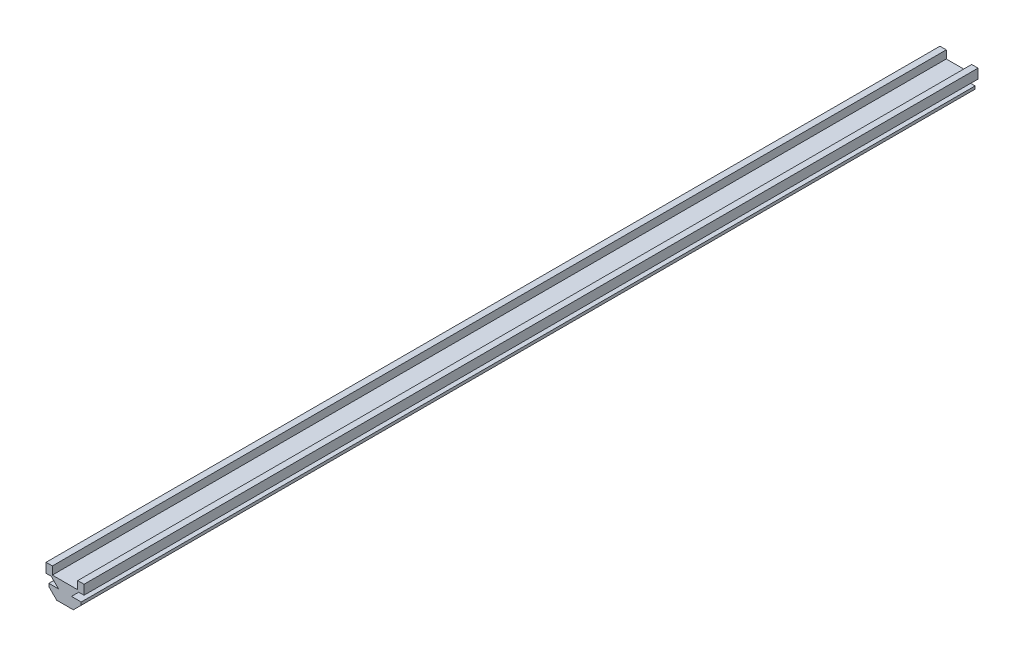
ISO-10303-21;
HEADER;
FILE_DESCRIPTION(('STEP AP214'),'2;1');
FILE_NAME('part.step','',(''),(''),'','','');
FILE_SCHEMA(('AUTOMOTIVE_DESIGN { 1 0 10303 214 1 1 1 1 }'));
ENDSEC;
DATA;
#1=APPLICATION_CONTEXT('core data for automotive mechanical design processes');
#2=APPLICATION_PROTOCOL_DEFINITION('international standard','automotive_design',2000,#1);
#3=PRODUCT_CONTEXT('',#1,'mechanical');
#4=PRODUCT('Part','Part','',(#3));
#5=PRODUCT_RELATED_PRODUCT_CATEGORY('part','',(#4));
#6=PRODUCT_DEFINITION_FORMATION('','',#4);
#7=PRODUCT_DEFINITION_CONTEXT('part definition',#1,'design');
#8=PRODUCT_DEFINITION('design','',#6,#7);
#9=PRODUCT_DEFINITION_SHAPE('','',#8);
#10=(LENGTH_UNIT() NAMED_UNIT(*) SI_UNIT(.MILLI.,.METRE.));
#11=(NAMED_UNIT(*) PLANE_ANGLE_UNIT() SI_UNIT($,.RADIAN.));
#12=(NAMED_UNIT(*) SI_UNIT($,.STERADIAN.) SOLID_ANGLE_UNIT());
#13=UNCERTAINTY_MEASURE_WITH_UNIT(LENGTH_MEASURE(1.E-05),#10,'distance_accuracy_value','');
#14=(GEOMETRIC_REPRESENTATION_CONTEXT(3) GLOBAL_UNCERTAINTY_ASSIGNED_CONTEXT((#13)) GLOBAL_UNIT_ASSIGNED_CONTEXT((#10,
#11,#12)) REPRESENTATION_CONTEXT('',''));
#15=CARTESIAN_POINT('',(0.,0.,0.));
#16=DIRECTION('',(0.,0.,1.));
#17=DIRECTION('',(1.,0.,0.));
#18=AXIS2_PLACEMENT_3D('',#15,#16,#17);
#19=CARTESIAN_POINT('',(4.00000000000002,0.,282.));
#20=DIRECTION('',(-1.,0.,0.));
#21=DIRECTION('',(0.,0.,1.));
#22=AXIS2_PLACEMENT_3D('',#19,#20,#21);
#23=PLANE('',#22);
#24=DIRECTION('',(0.,1.,0.));
#25=VECTOR('',#24,1.);
#26=CARTESIAN_POINT('',(4.00000000000002,0.,0.));
#27=LINE('',#26,#25);
#28=CARTESIAN_POINT('',(4.00000000000002,0.,0.));
#29=VERTEX_POINT('',#28);
#30=CARTESIAN_POINT('',(4.00000000000002,3.00000000000007,0.));
#31=VERTEX_POINT('',#30);
#32=EDGE_CURVE('E201',#29,#31,#27,.T.);
#33=ORIENTED_EDGE('',*,*,#32,.F.);
#34=DIRECTION('',(0.,0.,-1.));
#35=VECTOR('',#34,1.);
#36=CARTESIAN_POINT('',(4.00000000000002,0.,282.));
#37=LINE('',#36,#35);
#38=CARTESIAN_POINT('',(4.00000000000002,0.,282.));
#39=VERTEX_POINT('',#38);
#40=EDGE_CURVE('E11',#39,#29,#37,.T.);
#41=ORIENTED_EDGE('',*,*,#40,.F.);
#42=DIRECTION('',(0.,1.,0.));
#43=VECTOR('',#42,1.);
#44=CARTESIAN_POINT('',(4.00000000000002,0.,282.));
#45=LINE('',#44,#43);
#46=CARTESIAN_POINT('',(4.00000000000002,3.00000000000007,282.));
#47=VERTEX_POINT('',#46);
#48=EDGE_CURVE('E264',#39,#47,#45,.T.);
#49=ORIENTED_EDGE('',*,*,#48,.T.);
#50=DIRECTION('',(0.,0.,-1.));
#51=VECTOR('',#50,1.);
#52=CARTESIAN_POINT('',(4.00000000000002,3.00000000000007,282.));
#53=LINE('',#52,#51);
#54=EDGE_CURVE('E122',#47,#31,#53,.T.);
#55=ORIENTED_EDGE('',*,*,#54,.T.);
#56=EDGE_LOOP('',(#33,#41,#49,#55));
#57=FACE_BOUND('',#56,.T.);
#58=ADVANCED_FACE('F41',(#57),#23,.T.);
#59=CARTESIAN_POINT('',(0.,0.,282.));
#60=DIRECTION('',(0.,-1.,0.));
#61=DIRECTION('',(1.,0.,0.));
#62=AXIS2_PLACEMENT_3D('',#59,#60,#61);
#63=PLANE('',#62);
#64=DIRECTION('',(-1.,0.,0.));
#65=VECTOR('',#64,1.);
#66=CARTESIAN_POINT('',(0.,0.,0.));
#67=LINE('',#66,#65);
#68=CARTESIAN_POINT('',(5.65710678118656,0.,0.));
#69=VERTEX_POINT('',#68);
#70=EDGE_CURVE('E205',#69,#29,#67,.T.);
#71=ORIENTED_EDGE('',*,*,#70,.F.);
#72=DIRECTION('',(0.,0.,-1.));
#73=VECTOR('',#72,1.);
#74=CARTESIAN_POINT('',(5.65710678118656,0.,282.));
#75=LINE('',#74,#73);
#76=CARTESIAN_POINT('',(5.65710678118656,0.,282.));
#77=VERTEX_POINT('',#76);
#78=EDGE_CURVE('E50',#77,#69,#75,.T.);
#79=ORIENTED_EDGE('',*,*,#78,.F.);
#80=DIRECTION('',(-1.,0.,0.));
#81=VECTOR('',#80,1.);
#82=CARTESIAN_POINT('',(0.,0.,282.));
#83=LINE('',#82,#81);
#84=EDGE_CURVE('E332',#77,#39,#83,.T.);
#85=ORIENTED_EDGE('',*,*,#84,.T.);
#86=ORIENTED_EDGE('',*,*,#40,.T.);
#87=EDGE_LOOP('',(#71,#79,#85,#86));
#88=FACE_BOUND('',#87,.T.);
#89=ADVANCED_FACE('F321',(#88),#63,.T.);
#90=CARTESIAN_POINT('',(2.82855339059332,2.82855339059331,282.));
#91=DIRECTION('',(-0.707106781186548,-0.707106781186547,0.));
#92=DIRECTION('',(0.707106781186547,-0.707106781186548,0.));
#93=AXIS2_PLACEMENT_3D('',#90,#91,#92);
#94=PLANE('',#93);
#95=DIRECTION('',(-0.707106781186547,0.707106781186548,0.));
#96=VECTOR('',#95,1.);
#97=CARTESIAN_POINT('',(2.82855339059332,2.82855339059331,0.));
#98=LINE('',#97,#96);
#99=CARTESIAN_POINT('',(7.95710678118658,-2.29999999999996,0.));
#100=VERTEX_POINT('',#99);
#101=EDGE_CURVE('E209',#100,#69,#98,.T.);
#102=ORIENTED_EDGE('',*,*,#101,.F.);
#103=DIRECTION('',(0.,0.,-1.));
#104=VECTOR('',#103,1.);
#105=CARTESIAN_POINT('',(7.95710678118658,-2.29999999999996,282.));
#106=LINE('',#105,#104);
#107=CARTESIAN_POINT('',(7.95710678118658,-2.29999999999996,282.));
#108=VERTEX_POINT('',#107);
#109=EDGE_CURVE('E308',#108,#100,#106,.T.);
#110=ORIENTED_EDGE('',*,*,#109,.F.);
#111=DIRECTION('',(-0.707106781186547,0.707106781186548,0.));
#112=VECTOR('',#111,1.);
#113=CARTESIAN_POINT('',(2.82855339059332,2.82855339059331,282.));
#114=LINE('',#113,#112);
#115=EDGE_CURVE('E317',#108,#77,#114,.T.);
#116=ORIENTED_EDGE('',*,*,#115,.T.);
#117=ORIENTED_EDGE('',*,*,#78,.T.);
#118=EDGE_LOOP('',(#102,#110,#116,#117));
#119=FACE_BOUND('',#118,.T.);
#120=ADVANCED_FACE('F315',(#119),#94,.T.);
#121=CARTESIAN_POINT('',(0.,-2.29999999999996,282.));
#122=DIRECTION('',(0.,1.,0.));
#123=DIRECTION('',(0.,0.,1.));
#124=AXIS2_PLACEMENT_3D('',#121,#122,#123);
#125=PLANE('',#124);
#126=DIRECTION('',(1.,0.,0.));
#127=VECTOR('',#126,1.);
#128=CARTESIAN_POINT('',(0.,-2.29999999999996,0.));
#129=LINE('',#128,#127);
#130=CARTESIAN_POINT('',(4.90000000000005,-2.29999999999996,0.));
#131=VERTEX_POINT('',#130);
#132=EDGE_CURVE('E213',#131,#100,#129,.T.);
#133=ORIENTED_EDGE('',*,*,#132,.F.);
#134=DIRECTION('',(0.,0.,-1.));
#135=VECTOR('',#134,1.);
#136=CARTESIAN_POINT('',(4.90000000000005,-2.29999999999996,282.));
#137=LINE('',#136,#135);
#138=CARTESIAN_POINT('',(4.90000000000005,-2.29999999999996,282.));
#139=VERTEX_POINT('',#138);
#140=EDGE_CURVE('E305',#139,#131,#137,.T.);
#141=ORIENTED_EDGE('',*,*,#140,.F.);
#142=DIRECTION('',(1.,0.,0.));
#143=VECTOR('',#142,1.);
#144=CARTESIAN_POINT('',(0.,-2.29999999999996,282.));
#145=LINE('',#144,#143);
#146=EDGE_CURVE('E331',#139,#108,#145,.T.);
#147=ORIENTED_EDGE('',*,*,#146,.T.);
#148=ORIENTED_EDGE('',*,*,#109,.T.);
#149=EDGE_LOOP('',(#133,#141,#147,#148));
#150=FACE_BOUND('',#149,.T.);
#151=ADVANCED_FACE('F327',(#150),#125,.T.);
#152=CARTESIAN_POINT('',(4.90000000000005,0.,282.));
#153=DIRECTION('',(1.,0.,0.));
#154=DIRECTION('',(0.,0.,-1.));
#155=AXIS2_PLACEMENT_3D('',#152,#153,#154);
#156=PLANE('',#155);
#157=DIRECTION('',(0.,-1.,0.));
#158=VECTOR('',#157,1.);
#159=CARTESIAN_POINT('',(4.90000000000005,0.,0.));
#160=LINE('',#159,#158);
#161=CARTESIAN_POINT('',(4.90000000000005,-3.20294372515229,0.));
#162=VERTEX_POINT('',#161);
#163=EDGE_CURVE('E217',#131,#162,#160,.T.);
#164=ORIENTED_EDGE('',*,*,#163,.T.);
#165=DIRECTION('',(0.,0.,-1.));
#166=VECTOR('',#165,1.);
#167=CARTESIAN_POINT('',(4.90000000000005,-3.20294372515229,282.));
#168=LINE('',#167,#166);
#169=CARTESIAN_POINT('',(4.90000000000005,-3.20294372515229,282.));
#170=VERTEX_POINT('',#169);
#171=EDGE_CURVE('E302',#170,#162,#168,.T.);
#172=ORIENTED_EDGE('',*,*,#171,.F.);
#173=DIRECTION('',(0.,-1.,0.));
#174=VECTOR('',#173,1.);
#175=CARTESIAN_POINT('',(4.90000000000005,0.,282.));
#176=LINE('',#175,#174);
#177=EDGE_CURVE('E337',#139,#170,#176,.T.);
#178=ORIENTED_EDGE('',*,*,#177,.F.);
#179=ORIENTED_EDGE('',*,*,#140,.T.);
#180=EDGE_LOOP('',(#164,#172,#178,#179));
#181=FACE_BOUND('',#180,.T.);
#182=ADVANCED_FACE('F394',(#181),#156,.F.);
#183=CARTESIAN_POINT('',(0.848528137423882,0.848528137423882,282.));
#184=DIRECTION('',(-0.707106781186548,-0.707106781186548,0.));
#185=DIRECTION('',(0.707106781186548,-0.707106781186548,0.));
#186=AXIS2_PLACEMENT_3D('',#183,#184,#185);
#187=PLANE('',#186);
#188=DIRECTION('',(-0.707106781186548,0.707106781186548,0.));
#189=VECTOR('',#188,1.);
#190=CARTESIAN_POINT('',(0.848528137423882,0.848528137423882,0.));
#191=LINE('',#190,#189);
#192=CARTESIAN_POINT('',(7.37205627484774,-5.67499999999998,0.));
#193=VERTEX_POINT('',#192);
#194=EDGE_CURVE('E221',#193,#162,#191,.T.);
#195=ORIENTED_EDGE('',*,*,#194,.F.);
#196=DIRECTION('',(0.,0.,-1.));
#197=VECTOR('',#196,1.);
#198=CARTESIAN_POINT('',(7.37205627484774,-5.67499999999998,282.));
#199=LINE('',#198,#197);
#200=CARTESIAN_POINT('',(7.37205627484774,-5.67499999999998,282.));
#201=VERTEX_POINT('',#200);
#202=EDGE_CURVE('E299',#201,#193,#199,.T.);
#203=ORIENTED_EDGE('',*,*,#202,.F.);
#204=DIRECTION('',(-0.707106781186548,0.707106781186548,0.));
#205=VECTOR('',#204,1.);
#206=CARTESIAN_POINT('',(0.848528137423882,0.848528137423882,282.));
#207=LINE('',#206,#205);
#208=EDGE_CURVE('E344',#201,#170,#207,.T.);
#209=ORIENTED_EDGE('',*,*,#208,.T.);
#210=ORIENTED_EDGE('',*,*,#171,.T.);
#211=EDGE_LOOP('',(#195,#203,#209,#210));
#212=FACE_BOUND('',#211,.T.);
#213=ADVANCED_FACE('F397',(#212),#187,.T.);
#214=CARTESIAN_POINT('',(0.,-5.675,282.));
#215=DIRECTION('',(0.,1.,0.));
#216=DIRECTION('',(-1.,0.,0.));
#217=AXIS2_PLACEMENT_3D('',#214,#215,#216);
#218=PLANE('',#217);
#219=DIRECTION('',(1.,0.,0.));
#220=VECTOR('',#219,1.);
#221=CARTESIAN_POINT('',(0.,-5.675,0.));
#222=LINE('',#221,#220);
#223=CARTESIAN_POINT('',(12.6279437251523,-5.67499999999996,0.));
#224=VERTEX_POINT('',#223);
#225=EDGE_CURVE('E225',#193,#224,#222,.T.);
#226=ORIENTED_EDGE('',*,*,#225,.T.);
#227=DIRECTION('',(0.,0.,-1.));
#228=VECTOR('',#227,1.);
#229=CARTESIAN_POINT('',(12.6279437251523,-5.67499999999996,282.));
#230=LINE('',#229,#228);
#231=CARTESIAN_POINT('',(12.6279437251523,-5.67499999999996,282.));
#232=VERTEX_POINT('',#231);
#233=EDGE_CURVE('E295',#232,#224,#230,.T.);
#234=ORIENTED_EDGE('',*,*,#233,.F.);
#235=DIRECTION('',(1.,0.,0.));
#236=VECTOR('',#235,1.);
#237=CARTESIAN_POINT('',(0.,-5.675,282.));
#238=LINE('',#237,#236);
#239=EDGE_CURVE('E348',#201,#232,#238,.T.);
#240=ORIENTED_EDGE('',*,*,#239,.F.);
#241=ORIENTED_EDGE('',*,*,#202,.T.);
#242=EDGE_LOOP('',(#226,#234,#240,#241));
#243=FACE_BOUND('',#242,.T.);
#244=ADVANCED_FACE('F401',(#243),#218,.F.);
#245=CARTESIAN_POINT('',(9.15147186257619,-9.15147186257612,282.));
#246=DIRECTION('',(-0.70710678118655,0.707106781186544,0.));
#247=DIRECTION('',(-0.707106781186545,-0.707106781186551,0.));
#248=AXIS2_PLACEMENT_3D('',#245,#246,#247);
#249=PLANE('',#248);
#250=DIRECTION('',(0.707106781186545,0.707106781186551,0.));
#251=VECTOR('',#250,1.);
#252=CARTESIAN_POINT('',(9.15147186257619,-9.15147186257612,0.));
#253=LINE('',#252,#251);
#254=CARTESIAN_POINT('',(15.1,-3.20294372515226,0.));
#255=VERTEX_POINT('',#254);
#256=EDGE_CURVE('E228',#224,#255,#253,.T.);
#257=ORIENTED_EDGE('',*,*,#256,.T.);
#258=DIRECTION('',(0.,0.,-1.));
#259=VECTOR('',#258,1.);
#260=CARTESIAN_POINT('',(15.1,-3.20294372515226,282.));
#261=LINE('',#260,#259);
#262=CARTESIAN_POINT('',(15.1,-3.20294372515226,282.));
#263=VERTEX_POINT('',#262);
#264=EDGE_CURVE('E292',#263,#255,#261,.T.);
#265=ORIENTED_EDGE('',*,*,#264,.F.);
#266=DIRECTION('',(0.707106781186545,0.707106781186551,0.));
#267=VECTOR('',#266,1.);
#268=CARTESIAN_POINT('',(9.15147186257619,-9.15147186257612,282.));
#269=LINE('',#268,#267);
#270=EDGE_CURVE('E351',#232,#263,#269,.T.);
#271=ORIENTED_EDGE('',*,*,#270,.F.);
#272=ORIENTED_EDGE('',*,*,#233,.T.);
#273=EDGE_LOOP('',(#257,#265,#271,#272));
#274=FACE_BOUND('',#273,.T.);
#275=ADVANCED_FACE('F405',(#274),#249,.F.);
#276=CARTESIAN_POINT('',(15.1,0.,282.));
#277=DIRECTION('',(1.,0.,0.));
#278=DIRECTION('',(0.,1.,0.));
#279=AXIS2_PLACEMENT_3D('',#276,#277,#278);
#280=PLANE('',#279);
#281=DIRECTION('',(0.,-1.,0.));
#282=VECTOR('',#281,1.);
#283=CARTESIAN_POINT('',(15.1,0.,0.));
#284=LINE('',#283,#282);
#285=CARTESIAN_POINT('',(15.1,-2.29999999999993,0.));
#286=VERTEX_POINT('',#285);
#287=EDGE_CURVE('E232',#286,#255,#284,.T.);
#288=ORIENTED_EDGE('',*,*,#287,.F.);
#289=DIRECTION('',(0.,0.,-1.));
#290=VECTOR('',#289,1.);
#291=CARTESIAN_POINT('',(15.1,-2.29999999999993,282.));
#292=LINE('',#291,#290);
#293=CARTESIAN_POINT('',(15.1,-2.29999999999993,282.));
#294=VERTEX_POINT('',#293);
#295=EDGE_CURVE('E289',#294,#286,#292,.T.);
#296=ORIENTED_EDGE('',*,*,#295,.F.);
#297=DIRECTION('',(0.,-1.,0.));
#298=VECTOR('',#297,1.);
#299=CARTESIAN_POINT('',(15.1,0.,282.));
#300=LINE('',#299,#298);
#301=EDGE_CURVE('E354',#294,#263,#300,.T.);
#302=ORIENTED_EDGE('',*,*,#301,.T.);
#303=ORIENTED_EDGE('',*,*,#264,.T.);
#304=EDGE_LOOP('',(#288,#296,#302,#303));
#305=FACE_BOUND('',#304,.T.);
#306=ADVANCED_FACE('F409',(#305),#280,.T.);
#307=CARTESIAN_POINT('',(0.,-2.3,282.));
#308=DIRECTION('',(0.,-1.,0.));
#309=DIRECTION('',(1.,0.,0.));
#310=AXIS2_PLACEMENT_3D('',#307,#308,#309);
#311=PLANE('',#310);
#312=DIRECTION('',(-1.,0.,0.));
#313=VECTOR('',#312,1.);
#314=CARTESIAN_POINT('',(0.,-2.3,0.));
#315=LINE('',#314,#313);
#316=CARTESIAN_POINT('',(12.0428932188135,-2.29999999999995,0.));
#317=VERTEX_POINT('',#316);
#318=EDGE_CURVE('E236',#286,#317,#315,.T.);
#319=ORIENTED_EDGE('',*,*,#318,.T.);
#320=DIRECTION('',(0.,0.,-1.));
#321=VECTOR('',#320,1.);
#322=CARTESIAN_POINT('',(12.0428932188135,-2.29999999999995,282.));
#323=LINE('',#322,#321);
#324=CARTESIAN_POINT('',(12.0428932188135,-2.29999999999995,282.));
#325=VERTEX_POINT('',#324);
#326=EDGE_CURVE('E285',#325,#317,#323,.T.);
#327=ORIENTED_EDGE('',*,*,#326,.F.);
#328=DIRECTION('',(-1.,0.,0.));
#329=VECTOR('',#328,1.);
#330=CARTESIAN_POINT('',(0.,-2.3,282.));
#331=LINE('',#330,#329);
#332=EDGE_CURVE('E358',#294,#325,#331,.T.);
#333=ORIENTED_EDGE('',*,*,#332,.F.);
#334=ORIENTED_EDGE('',*,*,#295,.T.);
#335=EDGE_LOOP('',(#319,#327,#333,#334));
#336=FACE_BOUND('',#335,.T.);
#337=ADVANCED_FACE('F413',(#336),#311,.F.);
#338=CARTESIAN_POINT('',(7.17144660940677,-7.1714466094067,282.));
#339=DIRECTION('',(-0.707106781186551,0.707106781186544,0.));
#340=DIRECTION('',(-0.707106781186544,-0.707106781186551,0.));
#341=AXIS2_PLACEMENT_3D('',#338,#339,#340);
#342=PLANE('',#341);
#343=DIRECTION('',(0.707106781186544,0.707106781186551,0.));
#344=VECTOR('',#343,1.);
#345=CARTESIAN_POINT('',(7.17144660940677,-7.1714466094067,0.));
#346=LINE('',#345,#344);
#347=CARTESIAN_POINT('',(14.3428932188135,0.,0.));
#348=VERTEX_POINT('',#347);
#349=EDGE_CURVE('E239',#317,#348,#346,.T.);
#350=ORIENTED_EDGE('',*,*,#349,.T.);
#351=DIRECTION('',(0.,0.,-1.));
#352=VECTOR('',#351,1.);
#353=CARTESIAN_POINT('',(14.3428932188135,0.,282.));
#354=LINE('',#353,#352);
#355=CARTESIAN_POINT('',(14.3428932188135,0.,282.));
#356=VERTEX_POINT('',#355);
#357=EDGE_CURVE('E281',#356,#348,#354,.T.);
#358=ORIENTED_EDGE('',*,*,#357,.F.);
#359=DIRECTION('',(0.707106781186544,0.707106781186551,0.));
#360=VECTOR('',#359,1.);
#361=CARTESIAN_POINT('',(7.17144660940677,-7.1714466094067,282.));
#362=LINE('',#361,#360);
#363=EDGE_CURVE('E361',#325,#356,#362,.T.);
#364=ORIENTED_EDGE('',*,*,#363,.F.);
#365=ORIENTED_EDGE('',*,*,#326,.T.);
#366=EDGE_LOOP('',(#350,#358,#364,#365));
#367=FACE_BOUND('',#366,.T.);
#368=ADVANCED_FACE('F417',(#367),#342,.F.);
#369=CARTESIAN_POINT('',(0.,0.,282.));
#370=DIRECTION('',(0.,1.,0.));
#371=DIRECTION('',(-1.,0.,0.));
#372=AXIS2_PLACEMENT_3D('',#369,#370,#371);
#373=PLANE('',#372);
#374=DIRECTION('',(1.,0.,0.));
#375=VECTOR('',#374,1.);
#376=CARTESIAN_POINT('',(0.,0.,0.));
#377=LINE('',#376,#375);
#378=CARTESIAN_POINT('',(16.,0.,0.));
#379=VERTEX_POINT('',#378);
#380=EDGE_CURVE('E242',#348,#379,#377,.T.);
#381=ORIENTED_EDGE('',*,*,#380,.T.);
#382=DIRECTION('',(0.,0.,-1.));
#383=VECTOR('',#382,1.);
#384=CARTESIAN_POINT('',(16.,0.,282.));
#385=LINE('',#384,#383);
#386=CARTESIAN_POINT('',(16.,0.,282.));
#387=VERTEX_POINT('',#386);
#388=EDGE_CURVE('E277',#387,#379,#385,.T.);
#389=ORIENTED_EDGE('',*,*,#388,.F.);
#390=DIRECTION('',(1.,0.,0.));
#391=VECTOR('',#390,1.);
#392=CARTESIAN_POINT('',(0.,0.,282.));
#393=LINE('',#392,#391);
#394=EDGE_CURVE('E364',#356,#387,#393,.T.);
#395=ORIENTED_EDGE('',*,*,#394,.F.);
#396=ORIENTED_EDGE('',*,*,#357,.T.);
#397=EDGE_LOOP('',(#381,#389,#395,#396));
#398=FACE_BOUND('',#397,.T.);
#399=ADVANCED_FACE('F421',(#398),#373,.F.);
#400=CARTESIAN_POINT('',(16.,0.,282.));
#401=DIRECTION('',(-1.,0.,0.));
#402=DIRECTION('',(0.,-1.,0.));
#403=AXIS2_PLACEMENT_3D('',#400,#401,#402);
#404=PLANE('',#403);
#405=DIRECTION('',(0.,1.,0.));
#406=VECTOR('',#405,1.);
#407=CARTESIAN_POINT('',(16.,0.,0.));
#408=LINE('',#407,#406);
#409=CARTESIAN_POINT('',(16.,3.0000000000001,0.));
#410=VERTEX_POINT('',#409);
#411=EDGE_CURVE('E245',#379,#410,#408,.T.);
#412=ORIENTED_EDGE('',*,*,#411,.T.);
#413=DIRECTION('',(0.,0.,-1.));
#414=VECTOR('',#413,1.);
#415=CARTESIAN_POINT('',(16.,3.0000000000001,282.));
#416=LINE('',#415,#414);
#417=CARTESIAN_POINT('',(16.,3.0000000000001,282.));
#418=VERTEX_POINT('',#417);
#419=EDGE_CURVE('E274',#418,#410,#416,.T.);
#420=ORIENTED_EDGE('',*,*,#419,.F.);
#421=DIRECTION('',(0.,1.,0.));
#422=VECTOR('',#421,1.);
#423=CARTESIAN_POINT('',(16.,0.,282.));
#424=LINE('',#423,#422);
#425=EDGE_CURVE('E367',#387,#418,#424,.T.);
#426=ORIENTED_EDGE('',*,*,#425,.F.);
#427=ORIENTED_EDGE('',*,*,#388,.T.);
#428=EDGE_LOOP('',(#412,#420,#426,#427));
#429=FACE_BOUND('',#428,.T.);
#430=ADVANCED_FACE('F425',(#429),#404,.F.);
#431=CARTESIAN_POINT('',(0.,3.00000000000003,282.));
#432=DIRECTION('',(0.,1.,0.));
#433=DIRECTION('',(-1.,0.,0.));
#434=AXIS2_PLACEMENT_3D('',#431,#432,#433);
#435=PLANE('',#434);
#436=DIRECTION('',(1.,0.,0.));
#437=VECTOR('',#436,1.);
#438=CARTESIAN_POINT('',(0.,3.00000000000003,0.));
#439=LINE('',#438,#437);
#440=CARTESIAN_POINT('',(14.,3.00000000000009,0.));
#441=VERTEX_POINT('',#440);
#442=EDGE_CURVE('E249',#441,#410,#439,.T.);
#443=ORIENTED_EDGE('',*,*,#442,.F.);
#444=DIRECTION('',(0.,0.,-1.));
#445=VECTOR('',#444,1.);
#446=CARTESIAN_POINT('',(14.,3.00000000000009,282.));
#447=LINE('',#446,#445);
#448=CARTESIAN_POINT('',(14.,3.00000000000009,282.));
#449=VERTEX_POINT('',#448);
#450=EDGE_CURVE('E271',#449,#441,#447,.T.);
#451=ORIENTED_EDGE('',*,*,#450,.F.);
#452=DIRECTION('',(1.,0.,0.));
#453=VECTOR('',#452,1.);
#454=CARTESIAN_POINT('',(0.,3.00000000000003,282.));
#455=LINE('',#454,#453);
#456=EDGE_CURVE('E195',#449,#418,#455,.T.);
#457=ORIENTED_EDGE('',*,*,#456,.T.);
#458=ORIENTED_EDGE('',*,*,#419,.T.);
#459=EDGE_LOOP('',(#443,#451,#457,#458));
#460=FACE_BOUND('',#459,.T.);
#461=ADVANCED_FACE('F373',(#460),#435,.T.);
#462=CARTESIAN_POINT('',(14.,0.,282.));
#463=DIRECTION('',(-1.,0.,0.));
#464=DIRECTION('',(0.,-1.,0.));
#465=AXIS2_PLACEMENT_3D('',#462,#463,#464);
#466=PLANE('',#465);
#467=DIRECTION('',(0.,1.,0.));
#468=VECTOR('',#467,1.);
#469=CARTESIAN_POINT('',(14.,0.,0.));
#470=LINE('',#469,#468);
#471=CARTESIAN_POINT('',(14.,0.50000000000006,0.));
#472=VERTEX_POINT('',#471);
#473=EDGE_CURVE('E253',#472,#441,#470,.T.);
#474=ORIENTED_EDGE('',*,*,#473,.F.);
#475=DIRECTION('',(0.,0.,-1.));
#476=VECTOR('',#475,1.);
#477=CARTESIAN_POINT('',(14.,0.50000000000006,282.));
#478=LINE('',#477,#476);
#479=CARTESIAN_POINT('',(14.,0.50000000000006,282.));
#480=VERTEX_POINT('',#479);
#481=EDGE_CURVE('E180',#480,#472,#478,.T.);
#482=ORIENTED_EDGE('',*,*,#481,.F.);
#483=DIRECTION('',(0.,1.,0.));
#484=VECTOR('',#483,1.);
#485=CARTESIAN_POINT('',(14.,0.,282.));
#486=LINE('',#485,#484);
#487=EDGE_CURVE('E191',#480,#449,#486,.T.);
#488=ORIENTED_EDGE('',*,*,#487,.T.);
#489=ORIENTED_EDGE('',*,*,#450,.T.);
#490=EDGE_LOOP('',(#474,#482,#488,#489));
#491=FACE_BOUND('',#490,.T.);
#492=ADVANCED_FACE('F378',(#491),#466,.T.);
#493=CARTESIAN_POINT('',(0.,0.500000000000027,282.));
#494=DIRECTION('',(0.,1.,0.));
#495=DIRECTION('',(-1.,0.,0.));
#496=AXIS2_PLACEMENT_3D('',#493,#494,#495);
#497=PLANE('',#496);
#498=DIRECTION('',(1.,0.,0.));
#499=VECTOR('',#498,1.);
#500=CARTESIAN_POINT('',(0.,0.500000000000027,0.));
#501=LINE('',#500,#499);
#502=CARTESIAN_POINT('',(6.00000000000003,0.500000000000041,0.));
#503=VERTEX_POINT('',#502);
#504=EDGE_CURVE('E178',#503,#472,#501,.T.);
#505=ORIENTED_EDGE('',*,*,#504,.F.);
#506=DIRECTION('',(0.,0.,-1.));
#507=VECTOR('',#506,1.);
#508=CARTESIAN_POINT('',(6.00000000000003,0.500000000000041,282.));
#509=LINE('',#508,#507);
#510=CARTESIAN_POINT('',(6.00000000000003,0.500000000000041,282.));
#511=VERTEX_POINT('',#510);
#512=EDGE_CURVE('E172',#511,#503,#509,.T.);
#513=ORIENTED_EDGE('',*,*,#512,.F.);
#514=DIRECTION('',(1.,0.,0.));
#515=VECTOR('',#514,1.);
#516=CARTESIAN_POINT('',(0.,0.500000000000027,282.));
#517=LINE('',#516,#515);
#518=EDGE_CURVE('E176',#511,#480,#517,.T.);
#519=ORIENTED_EDGE('',*,*,#518,.T.);
#520=ORIENTED_EDGE('',*,*,#481,.T.);
#521=EDGE_LOOP('',(#505,#513,#519,#520));
#522=FACE_BOUND('',#521,.T.);
#523=ADVANCED_FACE('F174',(#522),#497,.T.);
#524=CARTESIAN_POINT('',(6.00000000000004,0.,282.));
#525=DIRECTION('',(-1.,0.,0.));
#526=DIRECTION('',(0.,-1.,0.));
#527=AXIS2_PLACEMENT_3D('',#524,#525,#526);
#528=PLANE('',#527);
#529=DIRECTION('',(0.,1.,0.));
#530=VECTOR('',#529,1.);
#531=CARTESIAN_POINT('',(6.00000000000004,0.,0.));
#532=LINE('',#531,#530);
#533=CARTESIAN_POINT('',(6.00000000000002,3.00000000000007,0.));
#534=VERTEX_POINT('',#533);
#535=EDGE_CURVE('E115',#503,#534,#532,.T.);
#536=ORIENTED_EDGE('',*,*,#535,.T.);
#537=DIRECTION('',(0.,0.,-1.));
#538=VECTOR('',#537,1.);
#539=CARTESIAN_POINT('',(6.00000000000002,3.00000000000007,282.));
#540=LINE('',#539,#538);
#541=CARTESIAN_POINT('',(6.00000000000002,3.00000000000007,282.));
#542=VERTEX_POINT('',#541);
#543=EDGE_CURVE('E181',#542,#534,#540,.T.);
#544=ORIENTED_EDGE('',*,*,#543,.F.);
#545=DIRECTION('',(0.,1.,0.));
#546=VECTOR('',#545,1.);
#547=CARTESIAN_POINT('',(6.00000000000004,0.,282.));
#548=LINE('',#547,#546);
#549=EDGE_CURVE('E183',#511,#542,#548,.T.);
#550=ORIENTED_EDGE('',*,*,#549,.F.);
#551=ORIENTED_EDGE('',*,*,#512,.T.);
#552=EDGE_LOOP('',(#536,#544,#550,#551));
#553=FACE_BOUND('',#552,.T.);
#554=ADVANCED_FACE('F184',(#553),#528,.F.);
#555=CARTESIAN_POINT('',(0.,3.00000000000007,282.));
#556=DIRECTION('',(0.,-1.,0.));
#557=DIRECTION('',(1.,0.,0.));
#558=AXIS2_PLACEMENT_3D('',#555,#556,#557);
#559=PLANE('',#558);
#560=DIRECTION('',(-1.,0.,0.));
#561=VECTOR('',#560,1.);
#562=CARTESIAN_POINT('',(0.,3.00000000000007,0.));
#563=LINE('',#562,#561);
#564=EDGE_CURVE('E261',#534,#31,#563,.T.);
#565=ORIENTED_EDGE('',*,*,#564,.T.);
#566=ORIENTED_EDGE('',*,*,#54,.F.);
#567=DIRECTION('',(-1.,0.,0.));
#568=VECTOR('',#567,1.);
#569=CARTESIAN_POINT('',(0.,3.00000000000007,282.));
#570=LINE('',#569,#568);
#571=EDGE_CURVE('E58',#542,#47,#570,.T.);
#572=ORIENTED_EDGE('',*,*,#571,.F.);
#573=ORIENTED_EDGE('',*,*,#543,.T.);
#574=EDGE_LOOP('',(#565,#566,#572,#573));
#575=FACE_BOUND('',#574,.T.);
#576=ADVANCED_FACE('F381',(#575),#559,.F.);
#577=CARTESIAN_POINT('',(0.,0.,282.));
#578=DIRECTION('',(0.,0.,1.));
#579=DIRECTION('',(1.,0.,0.));
#580=AXIS2_PLACEMENT_3D('',#577,#578,#579);
#581=PLANE('',#580);
#582=ORIENTED_EDGE('',*,*,#48,.F.);
#583=ORIENTED_EDGE('',*,*,#84,.F.);
#584=ORIENTED_EDGE('',*,*,#115,.F.);
#585=ORIENTED_EDGE('',*,*,#146,.F.);
#586=ORIENTED_EDGE('',*,*,#177,.T.);
#587=ORIENTED_EDGE('',*,*,#208,.F.);
#588=ORIENTED_EDGE('',*,*,#239,.T.);
#589=ORIENTED_EDGE('',*,*,#270,.T.);
#590=ORIENTED_EDGE('',*,*,#301,.F.);
#591=ORIENTED_EDGE('',*,*,#332,.T.);
#592=ORIENTED_EDGE('',*,*,#363,.T.);
#593=ORIENTED_EDGE('',*,*,#394,.T.);
#594=ORIENTED_EDGE('',*,*,#425,.T.);
#595=ORIENTED_EDGE('',*,*,#456,.F.);
#596=ORIENTED_EDGE('',*,*,#487,.F.);
#597=ORIENTED_EDGE('',*,*,#518,.F.);
#598=ORIENTED_EDGE('',*,*,#549,.T.);
#599=ORIENTED_EDGE('',*,*,#571,.T.);
#600=EDGE_LOOP('',(#582,#583,#584,#585,#586,#587,#588,#589,#590,#591,#592,#593,#594,#595,#596,
#597,#598,#599));
#601=FACE_BOUND('',#600,.T.);
#602=ADVANCED_FACE('F188',(#601),#581,.T.);
#603=CARTESIAN_POINT('',(0.,0.,0.));
#604=DIRECTION('',(0.,0.,1.));
#605=DIRECTION('',(1.,0.,0.));
#606=AXIS2_PLACEMENT_3D('',#603,#604,#605);
#607=PLANE('',#606);
#608=ORIENTED_EDGE('',*,*,#32,.T.);
#609=ORIENTED_EDGE('',*,*,#564,.F.);
#610=ORIENTED_EDGE('',*,*,#535,.F.);
#611=ORIENTED_EDGE('',*,*,#504,.T.);
#612=ORIENTED_EDGE('',*,*,#473,.T.);
#613=ORIENTED_EDGE('',*,*,#442,.T.);
#614=ORIENTED_EDGE('',*,*,#411,.F.);
#615=ORIENTED_EDGE('',*,*,#380,.F.);
#616=ORIENTED_EDGE('',*,*,#349,.F.);
#617=ORIENTED_EDGE('',*,*,#318,.F.);
#618=ORIENTED_EDGE('',*,*,#287,.T.);
#619=ORIENTED_EDGE('',*,*,#256,.F.);
#620=ORIENTED_EDGE('',*,*,#225,.F.);
#621=ORIENTED_EDGE('',*,*,#194,.T.);
#622=ORIENTED_EDGE('',*,*,#163,.F.);
#623=ORIENTED_EDGE('',*,*,#132,.T.);
#624=ORIENTED_EDGE('',*,*,#101,.T.);
#625=ORIENTED_EDGE('',*,*,#70,.T.);
#626=EDGE_LOOP('',(#608,#609,#610,#611,#612,#613,#614,#615,#616,#617,#618,#619,#620,#621,#622,
#623,#624,#625));
#627=FACE_BOUND('',#626,.T.);
#628=ADVANCED_FACE('F323',(#627),#607,.F.);
#629=CLOSED_SHELL('',(#58,#89,#120,#151,#182,#213,#244,#275,#306,#337,#368,#399,#430,#461,#492,
#523,#554,#576,#602,#628));
#630=MANIFOLD_SOLID_BREP('B2',#629);
#631=ADVANCED_BREP_SHAPE_REPRESENTATION('',(#18,#630),#14);
#632=SHAPE_DEFINITION_REPRESENTATION(#9,#631);
ENDSEC;
END-ISO-10303-21;
